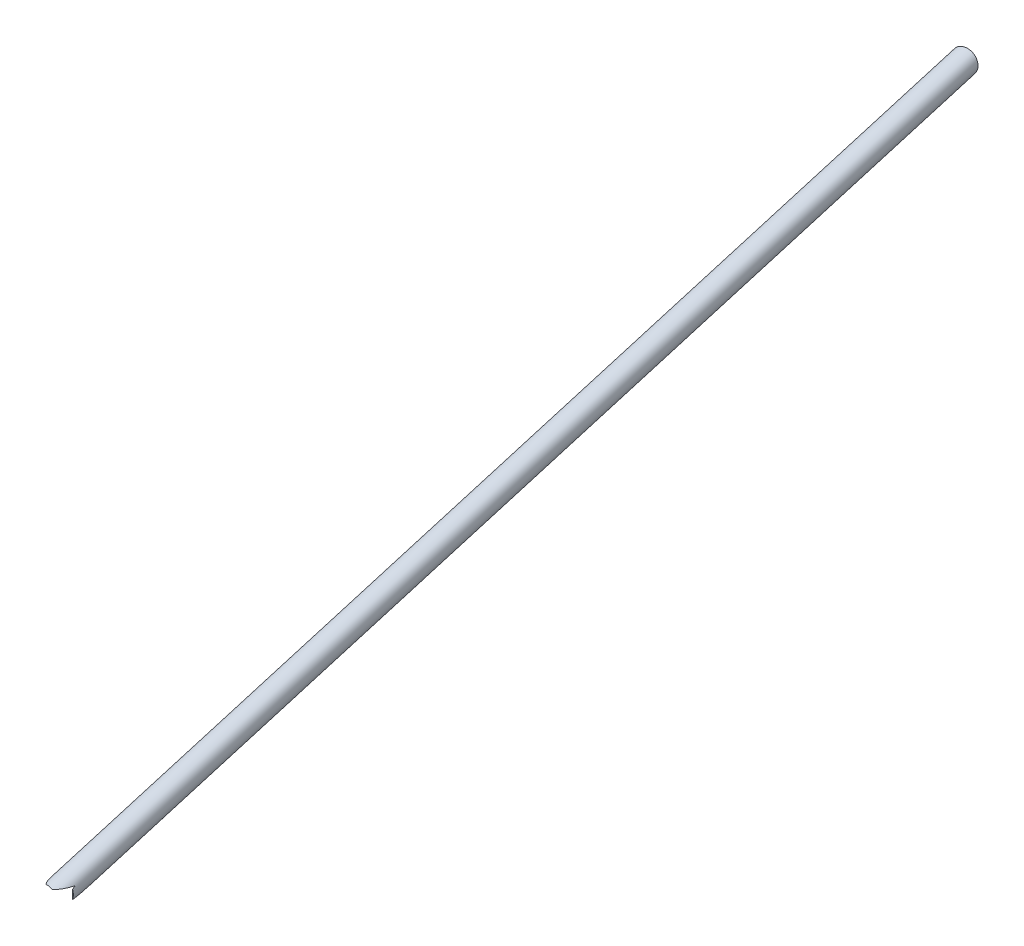
ISO-10303-21;
HEADER;
FILE_DESCRIPTION(('STEP AP214'),'2;1');
FILE_NAME('part.step','',(''),(''),'','','');
FILE_SCHEMA(('AUTOMOTIVE_DESIGN { 1 0 10303 214 1 1 1 1 }'));
ENDSEC;
DATA;
#1=APPLICATION_CONTEXT('core data for automotive mechanical design processes');
#2=APPLICATION_PROTOCOL_DEFINITION('international standard','automotive_design',2000,#1);
#3=PRODUCT_CONTEXT('',#1,'mechanical');
#4=PRODUCT('Part','Part','',(#3));
#5=PRODUCT_RELATED_PRODUCT_CATEGORY('part','',(#4));
#6=PRODUCT_DEFINITION_FORMATION('','',#4);
#7=PRODUCT_DEFINITION_CONTEXT('part definition',#1,'design');
#8=PRODUCT_DEFINITION('design','',#6,#7);
#9=PRODUCT_DEFINITION_SHAPE('','',#8);
#10=(LENGTH_UNIT() NAMED_UNIT(*) SI_UNIT(.MILLI.,.METRE.));
#11=(NAMED_UNIT(*) PLANE_ANGLE_UNIT() SI_UNIT($,.RADIAN.));
#12=(NAMED_UNIT(*) SI_UNIT($,.STERADIAN.) SOLID_ANGLE_UNIT());
#13=UNCERTAINTY_MEASURE_WITH_UNIT(LENGTH_MEASURE(1.E-05),#10,'distance_accuracy_value','');
#14=(GEOMETRIC_REPRESENTATION_CONTEXT(3) GLOBAL_UNCERTAINTY_ASSIGNED_CONTEXT((#13)) GLOBAL_UNIT_ASSIGNED_CONTEXT((#10,
#11,#12)) REPRESENTATION_CONTEXT('',''));
#15=CARTESIAN_POINT('',(0.,0.,0.));
#16=DIRECTION('',(0.,0.,1.));
#17=DIRECTION('',(1.,0.,0.));
#18=AXIS2_PLACEMENT_3D('',#15,#16,#17);
#19=CARTESIAN_POINT('',(-150.,500.,-1140.));
#20=DIRECTION('',(-0.0991899501072693,-0.396759800429077,0.912547540986877));
#21=DIRECTION('',(0.,-0.917070056253235,-0.39872611141445));
#22=AXIS2_PLACEMENT_3D('',#19,#20,#21);
#23=CYLINDRICAL_SURFACE('',#22,9.49999999999999);
#24=CARTESIAN_POINT('',(-225.,200.,-450.));
#25=DIRECTION('',(-0.526368183981438,-0.821349611595142,-0.219821178289519));
#26=DIRECTION('',(-0.00585697944915487,-0.255026319830916,0.966916372798202));
#27=AXIS2_PLACEMENT_3D('',#24,#25,#26);
#28=ELLIPSE('',#27,53.5236397538821,9.49999999999999);
#29=CARTESIAN_POINT('',(-232.244654819336,210.,-470.016908058468));
#30=VERTEX_POINT('',#29);
#31=CARTESIAN_POINT('',(-221.079548000573,210.,-496.752080009965));
#32=VERTEX_POINT('',#31);
#33=EDGE_CURVE('E117',#30,#32,#28,.T.);
#34=ORIENTED_EDGE('',*,*,#33,.F.);
#35=CARTESIAN_POINT('',(-222.5,210.,-473.));
#36=DIRECTION('',(0.,-1.,0.));
#37=DIRECTION('',(-0.108059180768419,0.,0.994144463069457));
#38=AXIS2_PLACEMENT_3D('',#35,#36,#37);
#39=ELLIPSE('',#38,23.9439580061442,9.49999999999999);
#40=CARTESIAN_POINT('',(-228.031798938339,210.,-450.838790555629));
#41=VERTEX_POINT('',#40);
#42=EDGE_CURVE('E103',#41,#30,#39,.T.);
#43=ORIENTED_EDGE('',*,*,#42,.F.);
#44=CARTESIAN_POINT('',(-225.,200.,-450.));
#45=DIRECTION('',(-0.151358668812016,0.0369657748955679,0.987787469480062));
#46=DIRECTION('',(0.0862856240757915,-0.994991904096065,0.0504569307542321));
#47=AXIS2_PLACEMENT_3D('',#44,#45,#46);
#48=ELLIPSE('',#47,10.5350735975657,9.49999999999999);
#49=CARTESIAN_POINT('',(-222.198724332156,210.,-449.944988564055));
#50=VERTEX_POINT('',#49);
#51=EDGE_CURVE('E111',#50,#41,#48,.T.);
#52=ORIENTED_EDGE('',*,*,#51,.F.);
#53=CARTESIAN_POINT('',(-215.,210.,-462.123534045365));
#54=VERTEX_POINT('',#53);
#55=EDGE_CURVE('E106',#54,#50,#39,.T.);
#56=ORIENTED_EDGE('',*,*,#55,.F.);
#57=CARTESIAN_POINT('',(-215.,240.000000000001,-542.000000000003));
#58=DIRECTION('',(-1.,0.,0.));
#59=DIRECTION('',(0.,-0.39872611141445,0.917070056253235));
#60=AXIS2_PLACEMENT_3D('',#57,#58,#59);
#61=ELLIPSE('',#60,95.7758320245769,9.49999999999999);
#62=CARTESIAN_POINT('',(-215.,208.496122260803,-460.));
#63=VERTEX_POINT('',#62);
#64=EDGE_CURVE('E168',#63,#54,#61,.T.);
#65=ORIENTED_EDGE('',*,*,#64,.F.);
#66=CARTESIAN_POINT('',(-223.913043478261,204.347826086957,-460.));
#67=DIRECTION('',(0.,0.,1.));
#68=DIRECTION('',(-0.242535625036333,-0.970142500145332,0.));
#69=AXIS2_PLACEMENT_3D('',#66,#67,#68);
#70=ELLIPSE('',#69,10.4104165244105,9.49999999999999);
#71=CARTESIAN_POINT('',(-215.,201.032135562644,-460.));
#72=VERTEX_POINT('',#71);
#73=EDGE_CURVE('E122',#72,#63,#70,.T.);
#74=ORIENTED_EDGE('',*,*,#73,.F.);
#75=CARTESIAN_POINT('',(-215.,210.,-491.994113013459));
#76=VERTEX_POINT('',#75);
#77=EDGE_CURVE('E118',#76,#72,#61,.T.);
#78=ORIENTED_EDGE('',*,*,#77,.F.);
#79=CARTESIAN_POINT('',(-222.5,210.,-473.));
#80=DIRECTION('',(0.,-1.,0.));
#81=DIRECTION('',(-0.108059180768419,0.,0.994144463069457));
#82=AXIS2_PLACEMENT_3D('',#79,#80,#81);
#83=ELLIPSE('',#82,23.9439580061442,9.49999999999999);
#84=EDGE_CURVE('E170',#32,#76,#83,.T.);
#85=ORIENTED_EDGE('',*,*,#84,.F.);
#86=EDGE_LOOP('',(#34,#43,#52,#56,#65,#74,#78,#85));
#87=FACE_BOUND('',#86,.T.);
#88=CARTESIAN_POINT('',(-150.,500.,-1140.));
#89=DIRECTION('',(-0.136924020573454,0.0230393226257372,-0.990313587810925));
#90=DIRECTION('',(-0.508281006832033,-0.859722512143853,0.0502754433782237));
#91=AXIS2_PLACEMENT_3D('',#88,#89,#90);
#92=ELLIPSE('',#91,10.5641498478138,9.49999999999999);
#93=CARTESIAN_POINT('',(-155.369556720972,490.917762554173,-1139.46888268249));
#94=VERTEX_POINT('',#93);
#95=EDGE_CURVE('E11',#94,#94,#92,.T.);
#96=ORIENTED_EDGE('',*,*,#95,.F.);
#97=EDGE_LOOP('',(#96));
#98=FACE_BOUND('',#97,.T.);
#99=ADVANCED_FACE('F39',(#87,#98),#23,.T.);
#100=CARTESIAN_POINT('',(-150.,500.,-1140.));
#101=DIRECTION('',(-0.0991899501072693,-0.396759800429077,0.912547540986877));
#102=DIRECTION('',(0.,-0.917070056253235,-0.39872611141445));
#103=AXIS2_PLACEMENT_3D('',#100,#101,#102);
#104=CYLINDRICAL_SURFACE('',#103,7.90000000000002);
#105=CARTESIAN_POINT('',(-222.5,210.,-473.));
#106=DIRECTION('',(0.,-1.,0.));
#107=DIRECTION('',(-0.108059180768419,0.,0.994144463069457));
#108=AXIS2_PLACEMENT_3D('',#105,#106,#107);
#109=ELLIPSE('',#108,19.9112913945832,7.90000000000002);
#110=CARTESIAN_POINT('',(-215.,210.,-469.534700662694));
#111=VERTEX_POINT('',#110);
#112=CARTESIAN_POINT('',(-230.198379719978,210.,-462.537283209683));
#113=VERTEX_POINT('',#112);
#114=EDGE_CURVE('E126',#111,#113,#109,.T.);
#115=ORIENTED_EDGE('',*,*,#114,.T.);
#116=CARTESIAN_POINT('',(-220.771578028085,209.66883444326,-492.051418421794));
#117=CARTESIAN_POINT('',(-220.682652490894,209.541890602561,-491.759451049876));
#118=CARTESIAN_POINT('',(-220.597491596655,209.417026826831,-491.465429267785));
#119=CARTESIAN_POINT('',(-220.433451678885,209.170904218371,-490.874131393424));
#120=CARTESIAN_POINT('',(-220.35457317169,209.049645682459,-490.576855035947));
#121=CARTESIAN_POINT('',(-220.202155914106,208.810293954164,-489.979570584515));
#122=CARTESIAN_POINT('',(-220.128618713068,208.692201686437,-489.679561726121));
#123=CARTESIAN_POINT('',(-219.986193672563,208.458902306111,-489.07732290046));
#124=CARTESIAN_POINT('',(-219.917305980295,208.343695284929,-488.77509286321));
#125=CARTESIAN_POINT('',(-219.716567888312,208.001734121431,-487.864816520339));
#126=CARTESIAN_POINT('',(-219.590829368066,207.778936864461,-487.253930215241));
#127=CARTESIAN_POINT('',(-219.352274580046,207.342560820701,-486.026522223195));
#128=CARTESIAN_POINT('',(-219.239456397889,207.128980671158,-485.41000138576));
#129=CARTESIAN_POINT('',(-219.023415673046,206.708307498717,-484.166689776188));
#130=CARTESIAN_POINT('',(-218.920289333352,206.501290785931,-483.539856565155));
#131=CARTESIAN_POINT('',(-218.723003159182,206.095367803868,-482.282150338162));
#132=CARTESIAN_POINT('',(-218.628843664866,205.896461842439,-481.651277169913));
#133=CARTESIAN_POINT('',(-218.448210154778,205.506917297655,-480.386741821921));
#134=CARTESIAN_POINT('',(-218.36172701038,205.316269036387,-479.753083921492));
#135=CARTESIAN_POINT('',(-218.195182217289,204.943214835221,-478.482523136877));
#136=CARTESIAN_POINT('',(-218.115120436025,204.760808725194,-477.845620319972));
#137=CARTESIAN_POINT('',(-217.960613488838,204.405198181415,-476.57013440941));
#138=CARTESIAN_POINT('',(-217.886156112772,204.231974002287,-475.931558301742));
#139=CARTESIAN_POINT('',(-217.741785080962,203.895253103692,-474.651303477282));
#140=CARTESIAN_POINT('',(-217.671871609538,203.73175677885,-474.009624635764));
#141=CARTESIAN_POINT('',(-217.535614940446,203.415651986625,-472.721599265614));
#142=CARTESIAN_POINT('',(-217.469280445333,203.263069788301,-472.075245343046));
#143=CARTESIAN_POINT('',(-217.33957209055,202.971576858541,-470.779235162399));
#144=CARTESIAN_POINT('',(-217.276197879112,202.832664500542,-470.129579306912));
#145=CARTESIAN_POINT('',(-217.152195842897,202.573206242114,-468.832445125078));
#146=CARTESIAN_POINT('',(-217.09154838099,202.452505771606,-468.1850001381));
#147=CARTESIAN_POINT('',(-217.001703759665,202.288221690192,-467.210710493891));
#148=CARTESIAN_POINT('',(-216.971934817186,202.236242085466,-466.885331793763));
#149=CARTESIAN_POINT('',(-216.912730793364,202.138886542546,-466.233554990749));
#150=CARTESIAN_POINT('',(-216.883295705403,202.09351047321,-465.907156908239));
#151=CARTESIAN_POINT('',(-216.82485908192,202.010737664824,-465.25456887248));
#152=CARTESIAN_POINT('',(-216.795856326055,201.973311336287,-464.92838281872));
#153=CARTESIAN_POINT('',(-216.738226391262,201.907778837855,-464.274992208329));
#154=CARTESIAN_POINT('',(-216.709599248662,201.879673563152,-463.947787556917));
#155=CARTESIAN_POINT('',(-216.652932922,201.834824016907,-463.292877062788));
#156=CARTESIAN_POINT('',(-216.624893153954,201.818067886067,-462.965172102993));
#157=CARTESIAN_POINT('',(-216.569753473683,201.798459698021,-462.309297202695));
#158=CARTESIAN_POINT('',(-216.542653291142,201.795603608307,-461.98112742468));
#159=CARTESIAN_POINT('',(-216.504260707065,201.80403556121,-461.501418141674));
#160=CARTESIAN_POINT('',(-216.492305040591,201.808542948553,-461.349803110482));
#161=CARTESIAN_POINT('',(-216.468870460533,201.821642237189,-461.046702419192));
#162=CARTESIAN_POINT('',(-216.457391562301,201.830234269894,-460.895216763414));
#163=CARTESIAN_POINT('',(-216.435048790392,201.851935078978,-460.592451926452));
#164=CARTESIAN_POINT('',(-216.4241851794,201.865045767837,-460.441172859968));
#165=CARTESIAN_POINT('',(-216.403268782368,201.896252192231,-460.139079917983));
#166=CARTESIAN_POINT('',(-216.39321598772,201.914347874831,-459.988266037561));
#167=CARTESIAN_POINT('',(-216.364690395932,201.976676654464,-459.53815454041));
#168=CARTESIAN_POINT('',(-216.347745617886,202.029040855787,-459.239815534296));
#169=CARTESIAN_POINT('',(-216.320513662837,202.159659543607,-458.648565636944));
#170=CARTESIAN_POINT('',(-216.310221903602,202.237896154358,-458.355651144951));
#171=CARTESIAN_POINT('',(-216.30187004257,202.390668431252,-457.882081149073));
#172=CARTESIAN_POINT('',(-216.300754878616,202.45655378431,-457.698681537424));
#173=CARTESIAN_POINT('',(-216.30409246113,202.60112900477,-457.337033266755));
#174=CARTESIAN_POINT('',(-216.308544426166,202.679817073766,-457.158783888412));
#175=CARTESIAN_POINT('',(-216.3243925092,202.850130269687,-456.808901378708));
#176=CARTESIAN_POINT('',(-216.335787519437,202.941753331044,-456.637267196537));
#177=CARTESIAN_POINT('',(-216.366941537122,203.137470850843,-456.302029313826));
#178=CARTESIAN_POINT('',(-216.386700610174,203.241565407102,-456.138425676286));
#179=CARTESIAN_POINT('',(-216.436034497217,203.461645012463,-455.819740104004));
#180=CARTESIAN_POINT('',(-216.465657972931,203.577686998514,-455.664704949194));
#181=CARTESIAN_POINT('',(-216.535828140046,203.819499086861,-455.365035245954));
#182=CARTESIAN_POINT('',(-216.576375125774,203.945269451217,-455.220400977903));
#183=CARTESIAN_POINT('',(-216.669253177098,204.204486536445,-454.942061059335));
#184=CARTESIAN_POINT('',(-216.721591276219,204.337937803535,-454.808361996937));
#185=CARTESIAN_POINT('',(-216.83855124524,204.610143211128,-454.552224706352));
#186=CARTESIAN_POINT('',(-216.90317300664,204.748897304784,-454.429786378716));
#187=CARTESIAN_POINT('',(-217.040426853571,205.020545894423,-454.203503071067));
#188=CARTESIAN_POINT('',(-217.112295326199,205.153257044218,-454.098972185197));
#189=CARTESIAN_POINT('',(-217.266957366716,205.419535200933,-453.899557135177));
#190=CARTESIAN_POINT('',(-217.349750304614,205.553102158078,-453.80467241531));
#191=CARTESIAN_POINT('',(-217.526078025235,205.819481026672,-453.624275225251));
#192=CARTESIAN_POINT('',(-217.619613615357,205.952292880581,-453.538763460458));
#193=CARTESIAN_POINT('',(-217.81710551445,206.215703179783,-453.376834205148));
#194=CARTESIAN_POINT('',(-217.921062699697,206.346301437869,-453.300417480552));
#195=CARTESIAN_POINT('',(-218.147905156701,206.614550115806,-453.150521362565));
#196=CARTESIAN_POINT('',(-218.271643431226,206.751901372985,-453.077795899493));
#197=CARTESIAN_POINT('',(-218.530169756308,207.021060595514,-452.942426093204));
#198=CARTESIAN_POINT('',(-218.664958281759,207.152868322257,-452.879782183593));
#199=CARTESIAN_POINT('',(-218.94486840899,207.409735348956,-452.764375061211));
#200=CARTESIAN_POINT('',(-219.08999250657,207.534793006026,-452.71161424622));
#201=CARTESIAN_POINT('',(-219.389707084989,207.777066235415,-452.615894222457));
#202=CARTESIAN_POINT('',(-219.544297689412,207.894281705314,-452.572935141681));
#203=CARTESIAN_POINT('',(-219.87108852692,208.126407532559,-452.494643303819));
#204=CARTESIAN_POINT('',(-220.04379024427,208.240806347562,-452.459884275889));
#205=CARTESIAN_POINT('',(-220.397581837054,208.458972948705,-452.401416809008));
#206=CARTESIAN_POINT('',(-220.578672056063,208.562740298843,-452.377708823125));
#207=CARTESIAN_POINT('',(-220.948007058464,208.758976395316,-452.341566368658));
#208=CARTESIAN_POINT('',(-221.136253215425,208.851442957983,-452.329134075923));
#209=CARTESIAN_POINT('',(-221.518501765359,209.024556165499,-452.315894061625));
#210=CARTESIAN_POINT('',(-221.712504141914,209.105202844056,-452.31508630691));
#211=CARTESIAN_POINT('',(-222.107090558476,209.25524590339,-452.325617260935));
#212=CARTESIAN_POINT('',(-222.307724983509,209.324500022901,-452.337097816968));
#213=CARTESIAN_POINT('',(-222.711748671154,209.450507960521,-452.373025760362));
#214=CARTESIAN_POINT('',(-222.915137984143,209.507261549709,-452.397473385159));
#215=CARTESIAN_POINT('',(-223.322899887183,209.608417157911,-452.46004545462));
#216=CARTESIAN_POINT('',(-223.52727252085,209.652818623805,-452.498170511576));
#217=CARTESIAN_POINT('',(-223.935054296507,209.729686374262,-452.588891684837));
#218=CARTESIAN_POINT('',(-224.138463469665,209.762153047539,-452.641487329742));
#219=CARTESIAN_POINT('',(-224.536921031898,209.815180610411,-452.760397490048));
#220=CARTESIAN_POINT('',(-224.732048794361,209.836031370979,-452.826316102589));
#221=CARTESIAN_POINT('',(-225.117308788758,209.868104652669,-452.97337713366));
#222=CARTESIAN_POINT('',(-225.307441123362,209.879327371826,-453.054519239024));
#223=CARTESIAN_POINT('',(-225.680304670355,209.893459622568,-453.232470511273));
#224=CARTESIAN_POINT('',(-225.86304386246,209.896378366459,-453.329262190621));
#225=CARTESIAN_POINT('',(-226.219127179657,209.895563223706,-453.538783140566));
#226=CARTESIAN_POINT('',(-226.392472267589,209.891830020182,-453.65151077353));
#227=CARTESIAN_POINT('',(-226.713937619496,209.880097168633,-453.88269408507));
#228=CARTESIAN_POINT('',(-226.86296003065,209.872473548768,-453.999916729791));
#229=CARTESIAN_POINT('',(-227.150068901856,209.854745803617,-454.246869350915));
#230=CARTESIAN_POINT('',(-227.288156426543,209.844641920207,-454.376598106973));
#231=CARTESIAN_POINT('',(-227.55245964415,209.823446390106,-454.647440127075));
#232=CARTESIAN_POINT('',(-227.678680016862,209.81235513617,-454.788548862316));
#233=CARTESIAN_POINT('',(-227.918931295218,209.790492934134,-455.080802262442));
#234=CARTESIAN_POINT('',(-228.032960535503,209.779722029939,-455.231948293904));
#235=CARTESIAN_POINT('',(-228.280567012035,209.756611877836,-455.588254096174));
#236=CARTESIAN_POINT('',(-228.410086636674,209.744737362983,-455.796267169596));
#237=CARTESIAN_POINT('',(-228.650158504279,209.724846644819,-456.223119280448));
#238=CARTESIAN_POINT('',(-228.760703623584,209.71683188856,-456.441962344267));
#239=CARTESIAN_POINT('',(-228.965082955145,209.705404394446,-456.888148495178));
#240=CARTESIAN_POINT('',(-229.058866515896,209.702005407333,-457.115514915602));
#241=CARTESIAN_POINT('',(-229.231544943581,209.700048379882,-457.575750943995));
#242=CARTESIAN_POINT('',(-229.310441558464,209.70148977084,-457.808619902266));
#243=CARTESIAN_POINT('',(-229.478518888729,209.710253917506,-458.352452895848));
#244=CARTESIAN_POINT('',(-229.563055920168,209.719293155036,-458.664815140667));
#245=CARTESIAN_POINT('',(-229.714537743651,209.744665526617,-459.293547406331));
#246=CARTESIAN_POINT('',(-229.781473109767,209.761002556146,-459.609919479827));
#247=CARTESIAN_POINT('',(-229.90130085223,209.799999536793,-460.245526147964));
#248=CARTESIAN_POINT('',(-229.954165259898,209.822671900007,-460.564765158955));
#249=CARTESIAN_POINT('',(-230.048384676346,209.87334115166,-461.204422207458));
#250=CARTESIAN_POINT('',(-230.089741716325,209.901337098946,-461.524840026766));
#251=CARTESIAN_POINT('',(-230.163279616726,209.961978023934,-462.168420381348));
#252=CARTESIAN_POINT('',(-230.195398351031,209.994652360863,-462.491587110535));
#253=CARTESIAN_POINT('',(-230.251715315604,210.063741650192,-463.138206543158));
#254=CARTESIAN_POINT('',(-230.275913295894,210.100156720601,-463.461659255298));
#255=CARTESIAN_POINT('',(-230.317604417104,210.176030559759,-464.108244298436));
#256=CARTESIAN_POINT('',(-230.335105391316,210.215485707293,-464.431376560075));
#257=CARTESIAN_POINT('',(-230.364396504478,210.296932232848,-465.077586795949));
#258=CARTESIAN_POINT('',(-230.376186416176,210.338923711718,-465.400664767512));
#259=CARTESIAN_POINT('',(-230.395705793472,210.429173666198,-466.078170974076));
#260=CARTESIAN_POINT('',(-230.402927430086,210.477644035485,-466.432585308157));
#261=CARTESIAN_POINT('',(-230.412139728923,210.576572470249,-467.141207612296));
#262=CARTESIAN_POINT('',(-230.414130256731,210.627030586768,-467.495415576818));
#263=CARTESIAN_POINT('',(-230.413160126537,210.780732937828,-468.557756525785));
#264=CARTESIAN_POINT('',(-230.403256363562,210.886297675788,-469.265551340706));
#265=CARTESIAN_POINT('',(-230.368104727869,211.100962751418,-470.680738042474));
#266=CARTESIAN_POINT('',(-230.342845205057,211.210065713913,-471.388129214823));
#267=CARTESIAN_POINT('',(-230.278765584883,211.429685189135,-472.802034533734));
#268=CARTESIAN_POINT('',(-230.239946185483,211.540201628825,-473.508548723559));
#269=CARTESIAN_POINT('',(-230.149888217029,211.760519890791,-474.917813102365));
#270=CARTESIAN_POINT('',(-230.098702968545,211.870322756828,-475.620566555318));
#271=CARTESIAN_POINT('',(-229.98413138814,212.088250524296,-477.025356331222));
#272=CARTESIAN_POINT('',(-229.920744781959,212.196375387949,-477.727392637696));
#273=CARTESIAN_POINT('',(-229.781581048556,212.409521575192,-479.130357195772));
#274=CARTESIAN_POINT('',(-229.705810002596,212.514544392276,-479.831285821583));
#275=CARTESIAN_POINT('',(-229.541110683866,212.720107724937,-481.232236712132));
#276=CARTESIAN_POINT('',(-229.452182929529,212.820648416925,-481.932259011487));
#277=CARTESIAN_POINT('',(-229.259889770041,213.015513414373,-483.330527419194));
#278=CARTESIAN_POINT('',(-229.156537730664,213.109843357059,-484.028774569404));
#279=CARTESIAN_POINT('',(-228.933137521559,213.290359453206,-485.423880092165));
#280=CARTESIAN_POINT('',(-228.813085246571,213.376543595487,-486.120738080376));
#281=CARTESIAN_POINT('',(-228.617775729351,213.497553037411,-487.164599637382));
#282=CARTESIAN_POINT('',(-228.550084854043,213.536534470263,-487.512542646626));
#283=CARTESIAN_POINT('',(-228.40898767767,213.611207946442,-488.207617667561));
#284=CARTESIAN_POINT('',(-228.335581568497,213.64690010012,-488.554749706077));
#285=CARTESIAN_POINT('',(-228.182271727402,213.71435651594,-489.247810796493));
#286=CARTESIAN_POINT('',(-228.102370765694,213.746122438294,-489.593740296333));
#287=CARTESIAN_POINT('',(-227.934959764746,213.80491451088,-490.284146203126));
#288=CARTESIAN_POINT('',(-227.84745030653,213.831941022564,-490.628622718934));
#289=CARTESIAN_POINT('',(-227.662996582907,213.88020752857,-491.316777639005));
#290=CARTESIAN_POINT('',(-227.566020040976,213.901426717607,-491.660448910677));
#291=CARTESIAN_POINT('',(-227.36069279594,213.936338829333,-492.345060307291));
#292=CARTESIAN_POINT('',(-227.252335387078,213.95002728485,-492.685998693211));
#293=CARTESIAN_POINT('',(-227.078895927009,213.962982050802,-493.193752018716));
#294=CARTESIAN_POINT('',(-227.019285761355,213.966037546319,-493.362342272125));
#295=CARTESIAN_POINT('',(-226.895832332515,213.969157838474,-493.697986796779));
#296=CARTESIAN_POINT('',(-226.831989501403,213.969222939903,-493.865041222826));
#297=CARTESIAN_POINT('',(-226.699403858198,213.965774724833,-494.196972147221));
#298=CARTESIAN_POINT('',(-226.63066610141,213.962265051781,-494.361850689929));
#299=CARTESIAN_POINT('',(-226.487286330833,213.95087768098,-494.688846221246));
#300=CARTESIAN_POINT('',(-226.412646004005,213.943001227422,-494.850963982906));
#301=CARTESIAN_POINT('',(-226.274186286344,213.924212690594,-495.134406556352));
#302=CARTESIAN_POINT('',(-226.211838336639,213.914418800081,-495.256520774869));
#303=CARTESIAN_POINT('',(-226.082050546472,213.890878122212,-495.497724594753));
#304=CARTESIAN_POINT('',(-226.014608489032,213.877129606389,-495.616812848725));
#305=CARTESIAN_POINT('',(-225.873972847126,213.844819118661,-495.850192778649));
#306=CARTESIAN_POINT('',(-225.800805828131,213.826278555637,-495.964503226264));
#307=CARTESIAN_POINT('',(-225.647290777846,213.783121249784,-496.186923682931));
#308=CARTESIAN_POINT('',(-225.566950634828,213.758511130385,-496.2950402936));
#309=CARTESIAN_POINT('',(-225.410453353633,213.705853359083,-496.486394291872));
#310=CARTESIAN_POINT('',(-225.335518609745,213.67889790052,-496.570914592331));
#311=CARTESIAN_POINT('',(-225.178406493205,213.618069562061,-496.730576001391));
#312=CARTESIAN_POINT('',(-225.096221522995,213.584189375562,-496.805707066917));
#313=CARTESIAN_POINT('',(-224.922960553667,213.507614329368,-496.943183774937));
#314=CARTESIAN_POINT('',(-224.831770881368,213.464796327476,-497.005323532483));
#315=CARTESIAN_POINT('',(-224.642881083849,213.369982307648,-497.109218877681));
#316=CARTESIAN_POINT('',(-224.545204945775,213.318019047964,-497.151045281647));
#317=CARTESIAN_POINT('',(-224.358819066721,213.212671022506,-497.205773403802));
#318=CARTESIAN_POINT('',(-224.270441134652,213.160206298306,-497.221545400852));
#319=CARTESIAN_POINT('',(-224.094991117535,213.051033609928,-497.232525598006));
#320=CARTESIAN_POINT('',(-224.007920423506,212.994321463928,-497.227713263095));
#321=CARTESIAN_POINT('',(-223.83179724123,212.874833486104,-497.19863188566));
#322=CARTESIAN_POINT('',(-223.743088262462,212.811922408324,-497.172926656243));
#323=CARTESIAN_POINT('',(-223.572315785639,212.686231675269,-497.104847384375));
#324=CARTESIAN_POINT('',(-223.490263576762,212.623452412162,-497.062445710911));
#325=CARTESIAN_POINT('',(-223.279271626203,212.456833725039,-496.932326073335));
#326=CARTESIAN_POINT('',(-223.156428361372,212.354129278481,-496.833407030099));
#327=CARTESIAN_POINT('',(-222.984009108224,212.203878300211,-496.669675824103));
#328=CARTESIAN_POINT('',(-222.92840939049,212.154332082881,-496.612407804579));
#329=CARTESIAN_POINT('',(-222.820681748202,212.056443417357,-496.493716933724));
#330=CARTESIAN_POINT('',(-222.768552743106,212.00810059747,-496.432295387636));
#331=CARTESIAN_POINT('',(-222.642599498694,211.889206052532,-496.275322265343));
#332=CARTESIAN_POINT('',(-222.570630606148,211.819353251336,-496.177767556525));
#333=CARTESIAN_POINT('',(-222.432272949208,211.68190716962,-495.977230213387));
#334=CARTESIAN_POINT('',(-222.365886859488,211.614314981377,-495.874245015375));
#335=CARTESIAN_POINT('',(-222.173493094771,211.414313905167,-495.558787634068));
#336=CARTESIAN_POINT('',(-222.054496748109,211.284917981752,-495.340139391252));
#337=CARTESIAN_POINT('',(-221.829813496349,211.032136400849,-494.892005035912));
#338=CARTESIAN_POINT('',(-221.724166641808,210.908769479909,-494.662489023454));
#339=CARTESIAN_POINT('',(-221.523332608825,210.667139335667,-494.196239304174));
#340=CARTESIAN_POINT('',(-221.428148973464,210.548877849361,-493.959503186916));
#341=CARTESIAN_POINT('',(-221.233299377389,210.300273479771,-493.447164811521));
#342=CARTESIAN_POINT('',(-221.134886413211,210.17057129593,-493.170779832565));
#343=CARTESIAN_POINT('',(-220.993909422079,209.979696842269,-492.752966421731));
#344=CARTESIAN_POINT('',(-220.948098373344,209.916791773264,-492.613402373646));
#345=CARTESIAN_POINT('',(-220.858424463096,209.792040672959,-492.33319163537));
#346=CARTESIAN_POINT('',(-220.814561458033,209.730194563832,-492.192545025852));
#347=CARTESIAN_POINT('',(-220.771578028085,209.66883444326,-492.051418421794));
#348=B_SPLINE_CURVE_WITH_KNOTS('',3,(#116,#117,#118,#119,#120,#121,#122,#123,#124,#125,#126,
#127,#128,#129,#130,#131,#132,#133,#134,#135,#136,#137,#138,#139,#140,#141,#142,#143,#144,#145,
#146,#147,#148,#149,#150,#151,#152,#153,#154,#155,#156,#157,#158,#159,#160,#161,#162,#163,#164,
#165,#166,#167,#168,#169,#170,#171,#172,#173,#174,#175,#176,#177,#178,#179,#180,#181,#182,#183,
#184,#185,#186,#187,#188,#189,#190,#191,#192,#193,#194,#195,#196,#197,#198,#199,#200,#201,#202,
#203,#204,#205,#206,#207,#208,#209,#210,#211,#212,#213,#214,#215,#216,#217,#218,#219,#220,#221,
#222,#223,#224,#225,#226,#227,#228,#229,#230,#231,#232,#233,#234,#235,#236,#237,#238,#239,#240,
#241,#242,#243,#244,#245,#246,#247,#248,#249,#250,#251,#252,#253,#254,#255,#256,#257,#258,#259,
#260,#261,#262,#263,#264,#265,#266,#267,#268,#269,#270,#271,#272,#273,#274,#275,#276,#277,#278,
#279,#280,#281,#282,#283,#284,#285,#286,#287,#288,#289,#290,#291,#292,#293,#294,#295,#296,#297,
#298,#299,#300,#301,#302,#303,#304,#305,#306,#307,#308,#309,#310,#311,#312,#313,#314,#315,#316,
#317,#318,#319,#320,#321,#322,#323,#324,#325,#326,#327,#328,#329,#330,#331,#332,#333,#334,#335,
#336,#337,#338,#339,#340,#341,#342,#343,#344,#345,#346,#347),.UNSPECIFIED.,.T.,.F.,(4,2,2,2,2,2,
2,2,2,2,2,2,2,2,2,2,2,2,2,2,2,2,2,2,2,2,2,2,2,2,2,2,2,2,2,2,2,2,2,2,2,2,2,2,2,2,2,2,2,2,2,2,2,2,
2,2,2,2,2,2,2,2,2,2,2,2,2,2,2,2,2,2,2,2,2,2,2,2,2,2,2,2,2,2,2,2,2,2,2,2,2,2,2,2,2,2,2,2,2,2,2,2,
2,2,2,2,2,2,2,2,2,2,2,2,2,4),(0.,0.991653166778924,1.98338775121514,2.97540886800219,
3.96746137629816,5.95403903199419,7.94032195830761,9.94460162773301,11.9489573002822,
13.9508965564,15.952794471145,17.9501964665972,19.9476794342461,21.9498187223299,
23.9517194886284,25.9355370304941,26.9280235043225,27.9204902651247,28.9091956273678,
29.897995917343,30.8857613588958,31.8732402251836,32.3296525629002,32.7860795854484,
33.2427000243223,33.6993156145156,34.6084207012451,35.5168989775338,36.1010440212513,
36.6851070804382,37.269076976828,37.8530514537476,38.4399504779836,39.0268653174762,
39.6141311893383,40.2013918742624,40.7515650730817,41.3017065583887,41.8518894184673,
42.4021185783538,42.9974396013392,43.5927862221034,44.1882770958393,44.7837757452838,
45.4131918826217,46.0426338222812,46.6721971983102,47.3017587789099,47.9386667251035,
48.575586333873,49.2125344588867,49.8494618368344,50.4696876190025,51.0899006437685,
51.7094253446776,52.3288864272982,52.8974148919828,53.4658879357578,54.0341358545268,
54.6024612993858,55.3372565358995,56.0723270384524,56.8095826051432,57.5467515531369,
58.5171480228453,59.4880630994033,60.460893879568,61.4335528333556,62.4126075045925,
63.3916930716146,64.3696299047369,65.3476056482794,66.4209121336156,67.4942461978199,
69.6410815112446,71.789547619933,73.9379031576999,76.0771554968605,78.2164559273089,
80.3547090133555,82.4928778654209,84.6290784502896,86.7658050881255,87.8355663542409,
88.9052917178796,89.9745631876153,91.0437530738361,92.1167247316046,93.1903321832894,
93.7268026571565,94.2632184516887,94.79908807219,95.3348050902404,95.7470391618826,
96.1594536849732,96.5700566345476,96.9802134791203,97.327985315427,97.6761260141606,
98.0294239261904,98.3814811701574,98.6912614009098,99.0013507417336,99.3347630456758,
99.6687294497307,100.229994450804,100.511775175239,100.793467758107,101.212900092635,
101.632532242229,102.473208149966,103.316349177985,104.15977483868,105.121846201265,
105.601211321981,106.080541059793),.UNSPECIFIED.);
#349=CARTESIAN_POINT('',(-221.009004228265,210.,-492.797123160762));
#350=VERTEX_POINT('',#349);
#351=EDGE_CURVE('E128',#113,#350,#348,.T.);
#352=ORIENTED_EDGE('',*,*,#351,.T.);
#353=CARTESIAN_POINT('',(-222.5,210.,-473.));
#354=DIRECTION('',(0.,-1.,0.));
#355=DIRECTION('',(-0.108059180768419,0.,0.994144463069457));
#356=AXIS2_PLACEMENT_3D('',#353,#354,#355);
#357=ELLIPSE('',#356,19.9112913945832,7.90000000000002);
#358=CARTESIAN_POINT('',(-215.,210.,-484.58294639613));
#359=VERTEX_POINT('',#358);
#360=EDGE_CURVE('E134',#350,#359,#357,.T.);
#361=ORIENTED_EDGE('',*,*,#360,.T.);
#362=CARTESIAN_POINT('',(-215.,240.000000000001,-542.000000000003));
#363=DIRECTION('',(-1.,0.,0.));
#364=DIRECTION('',(0.,-0.39872611141445,0.917070056253235));
#365=AXIS2_PLACEMENT_3D('',#362,#363,#364);
#366=ELLIPSE('',#365,79.6451655783327,7.90000000000002);
#367=EDGE_CURVE('E84',#359,#111,#366,.T.);
#368=ORIENTED_EDGE('',*,*,#367,.T.);
#369=EDGE_LOOP('',(#115,#352,#361,#368));
#370=FACE_BOUND('',#369,.T.);
#371=CARTESIAN_POINT('',(-150.,500.,-1140.));
#372=DIRECTION('',(-0.136924020573454,0.0230393226257372,-0.990313587810925));
#373=DIRECTION('',(-0.508281006832033,-0.859722512143853,0.0502754433782237));
#374=AXIS2_PLACEMENT_3D('',#371,#372,#373);
#375=ELLIPSE('',#374,8.78492461028727,7.90000000000002);
#376=CARTESIAN_POINT('',(-154.465210325861,492.447402545049,-1139.55833402017));
#377=VERTEX_POINT('',#376);
#378=EDGE_CURVE('E43',#377,#377,#375,.T.);
#379=ORIENTED_EDGE('',*,*,#378,.T.);
#380=EDGE_LOOP('',(#379));
#381=FACE_BOUND('',#380,.T.);
#382=ADVANCED_FACE('F136',(#370,#381),#104,.F.);
#383=CARTESIAN_POINT('',(-225.,200.,-450.));
#384=DIRECTION('',(-0.0876619818920292,0.105194378270435,-0.99058039537993));
#385=DIRECTION('',(0.,0.994408591727349,0.105600912395825));
#386=AXIS2_PLACEMENT_3D('',#383,#384,#385);
#387=CYLINDRICAL_SURFACE('',#386,9.49999999999999);
#388=ORIENTED_EDGE('',*,*,#33,.T.);
#389=CARTESIAN_POINT('',(-233.333333333333,210.,-544.166666666664));
#390=DIRECTION('',(0.,-1.,0.));
#391=DIRECTION('',(-0.0881510722971012,0.,-0.996107116957243));
#392=AXIS2_PLACEMENT_3D('',#389,#390,#391);
#393=ELLIPSE('',#392,90.3090084869104,9.49999999999999);
#394=EDGE_CURVE('E58',#32,#350,#393,.T.);
#395=ORIENTED_EDGE('',*,*,#394,.T.);
#396=ORIENTED_EDGE('',*,*,#351,.F.);
#397=EDGE_CURVE('E171',#113,#30,#393,.T.);
#398=ORIENTED_EDGE('',*,*,#397,.T.);
#399=EDGE_LOOP('',(#388,#395,#396,#398));
#400=FACE_BOUND('',#399,.T.);
#401=ADVANCED_FACE('F139',(#400),#387,.F.);
#402=CARTESIAN_POINT('',(225.,190.,-460.));
#403=DIRECTION('',(0.,0.,1.));
#404=DIRECTION('',(1.,0.,0.));
#405=AXIS2_PLACEMENT_3D('',#402,#403,#404);
#406=PLANE('',#405);
#407=ORIENTED_EDGE('',*,*,#73,.T.);
#408=DIRECTION('',(0.,-1.,0.));
#409=VECTOR('',#408,1.);
#410=CARTESIAN_POINT('',(-215.,190.,-460.));
#411=LINE('',#410,#409);
#412=EDGE_CURVE('E90',#63,#72,#411,.T.);
#413=ORIENTED_EDGE('',*,*,#412,.T.);
#414=EDGE_LOOP('',(#407,#413));
#415=FACE_BOUND('',#414,.T.);
#416=ADVANCED_FACE('F144',(#415),#406,.T.);
#417=CARTESIAN_POINT('',(-150.,0.,-825.));
#418=DIRECTION('',(-0.173785333909047,0.463427557090794,0.868926669545238));
#419=DIRECTION('',(0.,-0.882352941176471,0.470588235294118));
#420=AXIS2_PLACEMENT_3D('',#417,#418,#419);
#421=CYLINDRICAL_SURFACE('',#420,9.49999999999999);
#422=ORIENTED_EDGE('',*,*,#51,.T.);
#423=CARTESIAN_POINT('',(-228.75,210.,-431.25));
#424=DIRECTION('',(0.,-1.,0.));
#425=DIRECTION('',(-0.196116135138184,0.,0.98058067569092));
#426=AXIS2_PLACEMENT_3D('',#423,#424,#425);
#427=ELLIPSE('',#426,20.4994283456881,9.49999999999999);
#428=EDGE_CURVE('E99',#41,#50,#427,.T.);
#429=ORIENTED_EDGE('',*,*,#428,.T.);
#430=EDGE_LOOP('',(#422,#429));
#431=FACE_BOUND('',#430,.T.);
#432=ADVANCED_FACE('F120',(#431),#421,.F.);
#433=CARTESIAN_POINT('',(225.,210.,-460.));
#434=DIRECTION('',(0.,-1.,0.));
#435=DIRECTION('',(0.,0.,-1.));
#436=AXIS2_PLACEMENT_3D('',#433,#434,#435);
#437=PLANE('',#436);
#438=ORIENTED_EDGE('',*,*,#114,.F.);
#439=DIRECTION('',(0.,0.,1.));
#440=VECTOR('',#439,1.);
#441=CARTESIAN_POINT('',(-215.,210.,-450.));
#442=LINE('',#441,#440);
#443=EDGE_CURVE('E110',#111,#54,#442,.T.);
#444=ORIENTED_EDGE('',*,*,#443,.T.);
#445=ORIENTED_EDGE('',*,*,#55,.T.);
#446=ORIENTED_EDGE('',*,*,#428,.F.);
#447=ORIENTED_EDGE('',*,*,#42,.T.);
#448=ORIENTED_EDGE('',*,*,#397,.F.);
#449=EDGE_LOOP('',(#438,#444,#445,#446,#447,#448));
#450=FACE_BOUND('',#449,.T.);
#451=ADVANCED_FACE('F101',(#450),#437,.T.);
#452=CARTESIAN_POINT('',(-215.,190.,-450.));
#453=DIRECTION('',(-1.,0.,0.));
#454=DIRECTION('',(0.,0.,1.));
#455=AXIS2_PLACEMENT_3D('',#452,#453,#454);
#456=PLANE('',#455);
#457=EDGE_CURVE('E49',#76,#359,#442,.T.);
#458=ORIENTED_EDGE('',*,*,#457,.F.);
#459=ORIENTED_EDGE('',*,*,#77,.T.);
#460=ORIENTED_EDGE('',*,*,#412,.F.);
#461=ORIENTED_EDGE('',*,*,#64,.T.);
#462=ORIENTED_EDGE('',*,*,#443,.F.);
#463=ORIENTED_EDGE('',*,*,#367,.F.);
#464=EDGE_LOOP('',(#458,#459,#460,#461,#462,#463));
#465=FACE_BOUND('',#464,.T.);
#466=ADVANCED_FACE('F147',(#465),#456,.T.);
#467=CARTESIAN_POINT('',(-235.,210.,-450.));
#468=DIRECTION('',(0.,-1.,0.));
#469=DIRECTION('',(0.,0.,-1.));
#470=AXIS2_PLACEMENT_3D('',#467,#468,#469);
#471=PLANE('',#470);
#472=ORIENTED_EDGE('',*,*,#84,.T.);
#473=ORIENTED_EDGE('',*,*,#457,.T.);
#474=ORIENTED_EDGE('',*,*,#360,.F.);
#475=ORIENTED_EDGE('',*,*,#394,.F.);
#476=EDGE_LOOP('',(#472,#473,#474,#475));
#477=FACE_BOUND('',#476,.T.);
#478=ADVANCED_FACE('F150',(#477),#471,.T.);
#479=CARTESIAN_POINT('',(-150.,500.,-1140.));
#480=DIRECTION('',(-0.136924020573454,0.0230393226257372,-0.990313587810925));
#481=DIRECTION('',(-0.990576526863067,0.,0.13696037539341));
#482=AXIS2_PLACEMENT_3D('',#479,#480,#481);
#483=PLANE('',#482);
#484=ORIENTED_EDGE('',*,*,#378,.F.);
#485=EDGE_LOOP('',(#484));
#486=FACE_BOUND('',#485,.T.);
#487=ORIENTED_EDGE('',*,*,#95,.T.);
#488=EDGE_LOOP('',(#487));
#489=FACE_BOUND('',#488,.T.);
#490=ADVANCED_FACE('F41',(#486,#489),#483,.T.);
#491=CLOSED_SHELL('',(#99,#382,#401,#416,#432,#451,#466,#478,#490));
#492=MANIFOLD_SOLID_BREP('B2',#491);
#493=ADVANCED_BREP_SHAPE_REPRESENTATION('',(#18,#492),#14);
#494=SHAPE_DEFINITION_REPRESENTATION(#9,#493);
ENDSEC;
END-ISO-10303-21;
